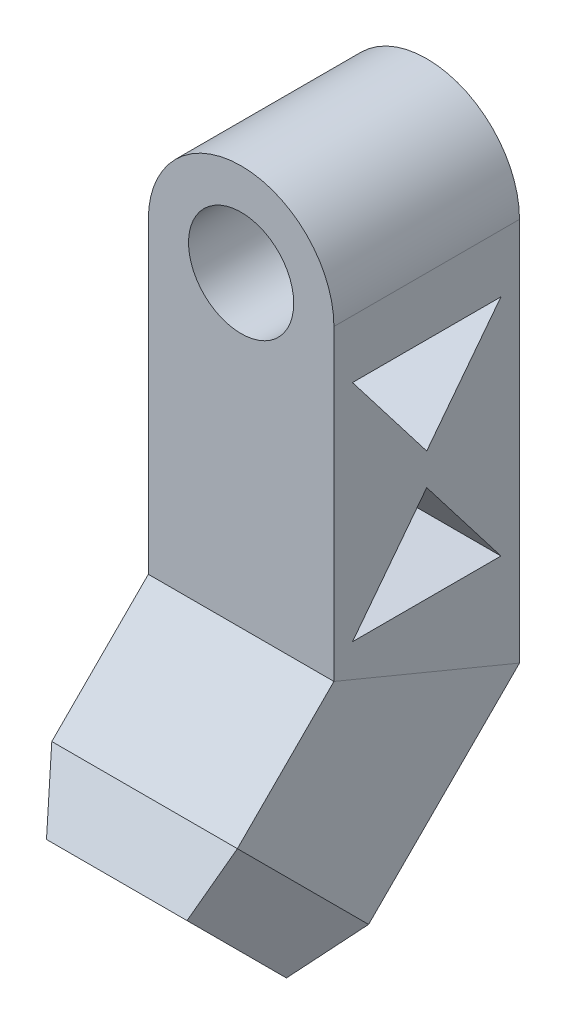
ISO-10303-21;
HEADER;
FILE_DESCRIPTION(('STEP AP214'),'2;1');
FILE_NAME('part.step','',(''),(''),'','','');
FILE_SCHEMA(('AUTOMOTIVE_DESIGN { 1 0 10303 214 1 1 1 1 }'));
ENDSEC;
DATA;
#1=APPLICATION_CONTEXT('core data for automotive mechanical design processes');
#2=APPLICATION_PROTOCOL_DEFINITION('international standard','automotive_design',2000,#1);
#3=PRODUCT_CONTEXT('',#1,'mechanical');
#4=PRODUCT('Part','Part','',(#3));
#5=PRODUCT_RELATED_PRODUCT_CATEGORY('part','',(#4));
#6=PRODUCT_DEFINITION_FORMATION('','',#4);
#7=PRODUCT_DEFINITION_CONTEXT('part definition',#1,'design');
#8=PRODUCT_DEFINITION('design','',#6,#7);
#9=PRODUCT_DEFINITION_SHAPE('','',#8);
#10=(LENGTH_UNIT() NAMED_UNIT(*) SI_UNIT(.MILLI.,.METRE.));
#11=(NAMED_UNIT(*) PLANE_ANGLE_UNIT() SI_UNIT($,.RADIAN.));
#12=(NAMED_UNIT(*) SI_UNIT($,.STERADIAN.) SOLID_ANGLE_UNIT());
#13=UNCERTAINTY_MEASURE_WITH_UNIT(LENGTH_MEASURE(1.E-05),#10,'distance_accuracy_value','');
#14=(GEOMETRIC_REPRESENTATION_CONTEXT(3) GLOBAL_UNCERTAINTY_ASSIGNED_CONTEXT((#13)) GLOBAL_UNIT_ASSIGNED_CONTEXT((#10,
#11,#12)) REPRESENTATION_CONTEXT('',''));
#15=CARTESIAN_POINT('',(0.,0.,0.));
#16=DIRECTION('',(0.,0.,1.));
#17=DIRECTION('',(1.,0.,0.));
#18=AXIS2_PLACEMENT_3D('',#15,#16,#17);
#19=CARTESIAN_POINT('',(19.05,45.0786722599583,7.26209610324912));
#20=DIRECTION('',(-1.,0.,0.));
#21=DIRECTION('',(0.,0.,1.));
#22=AXIS2_PLACEMENT_3D('',#19,#20,#21);
#23=PLANE('',#22);
#24=DIRECTION('',(0.,0.382683432365091,0.923879532511287));
#25=VECTOR('',#24,1.);
#26=CARTESIAN_POINT('',(19.05,42.5318762324136,41.3600079491902));
#27=LINE('',#26,#25);
#28=CARTESIAN_POINT('',(19.05,17.5092316367925,-19.05));
#29=VERTEX_POINT('',#28);
#30=CARTESIAN_POINT('',(19.05,33.2907683632075,19.05));
#31=VERTEX_POINT('',#30);
#32=EDGE_CURVE('E278',#29,#31,#27,.T.);
#33=ORIENTED_EDGE('',*,*,#32,.T.);
#34=DIRECTION('',(0.,-0.707106781186546,0.707106781186549));
#35=VECTOR('',#34,1.);
#36=CARTESIAN_POINT('',(19.05,45.0786722599583,7.26209610324912));
#37=LINE('',#36,#35);
#38=CARTESIAN_POINT('',(19.05,13.4703841816038,38.8703841816038));
#39=VERTEX_POINT('',#38);
#40=EDGE_CURVE('E49',#31,#39,#37,.T.);
#41=ORIENTED_EDGE('',*,*,#40,.T.);
#42=DIRECTION('',(0.,-0.707106781186549,-0.707106781186546));
#43=VECTOR('',#42,1.);
#44=CARTESIAN_POINT('',(19.05,13.4703841816038,38.8703841816038));
#45=LINE('',#44,#43);
#46=CARTESIAN_POINT('',(19.05,-13.4703841816038,11.9296158183964));
#47=VERTEX_POINT('',#46);
#48=EDGE_CURVE('E317',#39,#47,#45,.T.);
#49=ORIENTED_EDGE('',*,*,#48,.T.);
#50=DIRECTION('',(0.,-0.707106781186546,0.707106781186549));
#51=VECTOR('',#50,1.);
#52=CARTESIAN_POINT('',(19.05,18.1379038967508,-19.6786722599583));
#53=LINE('',#52,#51);
#54=EDGE_CURVE('E328',#29,#47,#53,.T.);
#55=ORIENTED_EDGE('',*,*,#54,.F.);
#56=EDGE_LOOP('',(#33,#41,#49,#55));
#57=FACE_BOUND('',#56,.T.);
#58=ADVANCED_FACE('F45',(#57),#23,.F.);
#59=CARTESIAN_POINT('',(-19.05,18.1379038967508,-19.6786722599583));
#60=DIRECTION('',(0.,0.707106781186549,0.707106781186546));
#61=DIRECTION('',(0.,-0.707106781186546,0.707106781186549));
#62=AXIS2_PLACEMENT_3D('',#59,#60,#61);
#63=PLANE('',#62);
#64=DIRECTION('',(1.,0.,0.));
#65=VECTOR('',#64,1.);
#66=CARTESIAN_POINT('',(-19.05,17.5092316367925,-19.05));
#67=LINE('',#66,#65);
#68=CARTESIAN_POINT('',(-19.05,17.5092316367925,-19.05));
#69=VERTEX_POINT('',#68);
#70=EDGE_CURVE('E11',#69,#29,#67,.T.);
#71=ORIENTED_EDGE('',*,*,#70,.T.);
#72=ORIENTED_EDGE('',*,*,#54,.T.);
#73=DIRECTION('',(-1.,0.,0.));
#74=VECTOR('',#73,1.);
#75=CARTESIAN_POINT('',(-19.05,-13.4703841816038,11.9296158183964));
#76=LINE('',#75,#74);
#77=CARTESIAN_POINT('',(-19.05,-13.4703841816038,11.9296158183964));
#78=VERTEX_POINT('',#77);
#79=EDGE_CURVE('E313',#47,#78,#76,.T.);
#80=ORIENTED_EDGE('',*,*,#79,.T.);
#81=DIRECTION('',(0.,-0.707106781186546,0.707106781186549));
#82=VECTOR('',#81,1.);
#83=CARTESIAN_POINT('',(-19.05,18.1379038967508,-19.6786722599583));
#84=LINE('',#83,#82);
#85=EDGE_CURVE('E325',#69,#78,#84,.T.);
#86=ORIENTED_EDGE('',*,*,#85,.F.);
#87=EDGE_LOOP('',(#71,#72,#80,#86));
#88=FACE_BOUND('',#87,.T.);
#89=ADVANCED_FACE('F352',(#88),#63,.F.);
#90=CARTESIAN_POINT('',(-19.05,45.0786722599583,7.26209610324912));
#91=DIRECTION('',(1.,0.,0.));
#92=DIRECTION('',(0.,0.,-1.));
#93=AXIS2_PLACEMENT_3D('',#90,#91,#92);
#94=PLANE('',#93);
#95=DIRECTION('',(0.,-0.382683432365091,-0.923879532511287));
#96=VECTOR('',#95,1.);
#97=CARTESIAN_POINT('',(-19.05,42.5318762324136,41.3600079491902));
#98=LINE('',#97,#96);
#99=CARTESIAN_POINT('',(-19.05,33.2907683632075,19.05));
#100=VERTEX_POINT('',#99);
#101=EDGE_CURVE('E55',#100,#69,#98,.T.);
#102=ORIENTED_EDGE('',*,*,#101,.T.);
#103=ORIENTED_EDGE('',*,*,#85,.T.);
#104=DIRECTION('',(0.,0.707106781186549,0.707106781186546));
#105=VECTOR('',#104,1.);
#106=CARTESIAN_POINT('',(-19.05,13.4703841816038,38.8703841816038));
#107=LINE('',#106,#105);
#108=CARTESIAN_POINT('',(-19.05,13.4703841816038,38.8703841816038));
#109=VERTEX_POINT('',#108);
#110=EDGE_CURVE('E309',#78,#109,#107,.T.);
#111=ORIENTED_EDGE('',*,*,#110,.T.);
#112=DIRECTION('',(0.,-0.707106781186546,0.707106781186549));
#113=VECTOR('',#112,1.);
#114=CARTESIAN_POINT('',(-19.05,45.0786722599583,7.26209610324912));
#115=LINE('',#114,#113);
#116=EDGE_CURVE('E321',#100,#109,#115,.T.);
#117=ORIENTED_EDGE('',*,*,#116,.F.);
#118=EDGE_LOOP('',(#102,#103,#111,#117));
#119=FACE_BOUND('',#118,.T.);
#120=ADVANCED_FACE('F350',(#119),#94,.F.);
#121=CARTESIAN_POINT('',(-19.05,45.0786722599583,7.26209610324912));
#122=DIRECTION('',(0.,-0.707106781186549,-0.707106781186546));
#123=DIRECTION('',(0.,0.707106781186546,-0.707106781186549));
#124=AXIS2_PLACEMENT_3D('',#121,#122,#123);
#125=PLANE('',#124);
#126=DIRECTION('',(-1.,0.,0.));
#127=VECTOR('',#126,1.);
#128=CARTESIAN_POINT('',(-19.05,33.2907683632075,19.05));
#129=LINE('',#128,#127);
#130=EDGE_CURVE('E274',#31,#100,#129,.T.);
#131=ORIENTED_EDGE('',*,*,#130,.T.);
#132=ORIENTED_EDGE('',*,*,#116,.T.);
#133=DIRECTION('',(1.,0.,0.));
#134=VECTOR('',#133,1.);
#135=CARTESIAN_POINT('',(-19.05,13.4703841816038,38.8703841816038));
#136=LINE('',#135,#134);
#137=EDGE_CURVE('E247',#109,#39,#136,.T.);
#138=ORIENTED_EDGE('',*,*,#137,.T.);
#139=ORIENTED_EDGE('',*,*,#40,.F.);
#140=EDGE_LOOP('',(#131,#132,#138,#139));
#141=FACE_BOUND('',#140,.T.);
#142=ADVANCED_FACE('F47',(#141),#125,.F.);
#143=CARTESIAN_POINT('',(-19.05,96.393,19.05));
#144=DIRECTION('',(0.,0.,-1.));
#145=DIRECTION('',(0.,1.,0.));
#146=AXIS2_PLACEMENT_3D('',#143,#144,#145);
#147=PLANE('',#146);
#148=CARTESIAN_POINT('',(0.,96.393,19.05));
#149=DIRECTION('',(0.,0.,1.));
#150=DIRECTION('',(1.,0.,0.));
#151=AXIS2_PLACEMENT_3D('',#148,#149,#150);
#152=CIRCLE('',#151,10.795);
#153=CARTESIAN_POINT('',(10.795,96.393,19.05));
#154=VERTEX_POINT('',#153);
#155=EDGE_CURVE('E224',#154,#154,#152,.T.);
#156=ORIENTED_EDGE('',*,*,#155,.F.);
#157=EDGE_LOOP('',(#156));
#158=FACE_BOUND('',#157,.T.);
#159=DIRECTION('',(0.,-1.,0.));
#160=VECTOR('',#159,1.);
#161=CARTESIAN_POINT('',(19.05,96.393,19.05));
#162=LINE('',#161,#160);
#163=CARTESIAN_POINT('',(19.05,96.393,19.05));
#164=VERTEX_POINT('',#163);
#165=EDGE_CURVE('E289',#164,#31,#162,.T.);
#166=ORIENTED_EDGE('',*,*,#165,.F.);
#167=CARTESIAN_POINT('',(0.,96.393,19.05));
#168=DIRECTION('',(0.,0.,-1.));
#169=DIRECTION('',(0.,1.,0.));
#170=AXIS2_PLACEMENT_3D('',#167,#168,#169);
#171=CIRCLE('',#170,19.05);
#172=CARTESIAN_POINT('',(-19.05,96.393,19.05));
#173=VERTEX_POINT('',#172);
#174=EDGE_CURVE('E236',#164,#173,#171,.F.);
#175=ORIENTED_EDGE('',*,*,#174,.T.);
#176=DIRECTION('',(0.,-1.,0.));
#177=VECTOR('',#176,1.);
#178=CARTESIAN_POINT('',(-19.05,96.393,19.05));
#179=LINE('',#178,#177);
#180=EDGE_CURVE('E296',#173,#100,#179,.T.);
#181=ORIENTED_EDGE('',*,*,#180,.T.);
#182=ORIENTED_EDGE('',*,*,#130,.F.);
#183=EDGE_LOOP('',(#166,#175,#181,#182));
#184=FACE_BOUND('',#183,.T.);
#185=ADVANCED_FACE('F383',(#158,#184),#147,.F.);
#186=CARTESIAN_POINT('',(-19.05,96.393,19.05));
#187=DIRECTION('',(1.,0.,0.));
#188=DIRECTION('',(0.,0.,-1.));
#189=AXIS2_PLACEMENT_3D('',#186,#187,#188);
#190=PLANE('',#189);
#191=DIRECTION('',(0.,-0.79225766010969,-0.610186692740443));
#192=VECTOR('',#191,1.);
#193=CARTESIAN_POINT('',(-19.05,38.4454298742545,-15.24));
#194=LINE('',#193,#192);
#195=CARTESIAN_POINT('',(-19.05,58.2328275407707,-2.22044604925031E-13));
#196=VERTEX_POINT('',#195);
#197=CARTESIAN_POINT('',(-19.05,38.4454298742545,-15.24));
#198=VERTEX_POINT('',#197);
#199=EDGE_CURVE('E174',#196,#198,#194,.T.);
#200=ORIENTED_EDGE('',*,*,#199,.F.);
#201=DIRECTION('',(0.,0.792257660109685,-0.610186692740449));
#202=VECTOR('',#201,1.);
#203=CARTESIAN_POINT('',(-19.05,58.2328275407707,-2.2940010280015E-13));
#204=LINE('',#203,#202);
#205=CARTESIAN_POINT('',(-19.05,38.4454298742543,15.24));
#206=VERTEX_POINT('',#205);
#207=EDGE_CURVE('E63',#206,#196,#204,.T.);
#208=ORIENTED_EDGE('',*,*,#207,.F.);
#209=DIRECTION('',(0.,0.,1.));
#210=VECTOR('',#209,1.);
#211=CARTESIAN_POINT('',(-19.05,38.4454298742545,-15.24));
#212=LINE('',#211,#210);
#213=EDGE_CURVE('E170',#198,#206,#212,.T.);
#214=ORIENTED_EDGE('',*,*,#213,.F.);
#215=EDGE_LOOP('',(#200,#208,#214));
#216=FACE_BOUND('',#215,.T.);
#217=DIRECTION('',(0.,0.792257660109685,0.610186692740449));
#218=VECTOR('',#217,1.);
#219=CARTESIAN_POINT('',(-19.05,64.7355055279154,-2.2940010280015E-13));
#220=LINE('',#219,#218);
#221=CARTESIAN_POINT('',(-19.05,64.7355055279154,-2.39391839684799E-13));
#222=VERTEX_POINT('',#221);
#223=CARTESIAN_POINT('',(-19.05,84.5229031944318,15.24));
#224=VERTEX_POINT('',#223);
#225=EDGE_CURVE('E203',#222,#224,#220,.T.);
#226=ORIENTED_EDGE('',*,*,#225,.F.);
#227=DIRECTION('',(0.,-0.79225766010969,0.610186692740443));
#228=VECTOR('',#227,1.);
#229=CARTESIAN_POINT('',(-19.05,84.5229031944316,-15.24));
#230=LINE('',#229,#228);
#231=CARTESIAN_POINT('',(-19.05,84.5229031944316,-15.24));
#232=VERTEX_POINT('',#231);
#233=EDGE_CURVE('E71',#232,#222,#230,.T.);
#234=ORIENTED_EDGE('',*,*,#233,.F.);
#235=DIRECTION('',(0.,0.,-1.));
#236=VECTOR('',#235,1.);
#237=CARTESIAN_POINT('',(-19.05,84.5229031944316,-15.24));
#238=LINE('',#237,#236);
#239=EDGE_CURVE('E199',#224,#232,#238,.T.);
#240=ORIENTED_EDGE('',*,*,#239,.F.);
#241=EDGE_LOOP('',(#226,#234,#240));
#242=FACE_BOUND('',#241,.T.);
#243=ORIENTED_EDGE('',*,*,#180,.F.);
#244=DIRECTION('',(0.,0.,1.));
#245=VECTOR('',#244,1.);
#246=CARTESIAN_POINT('',(-19.05,96.393,19.05));
#247=LINE('',#246,#245);
#248=CARTESIAN_POINT('',(-19.05,96.393,-19.05));
#249=VERTEX_POINT('',#248);
#250=EDGE_CURVE('E283',#249,#173,#247,.T.);
#251=ORIENTED_EDGE('',*,*,#250,.F.);
#252=DIRECTION('',(0.,-1.,0.));
#253=VECTOR('',#252,1.);
#254=CARTESIAN_POINT('',(-19.05,96.393,-19.05));
#255=LINE('',#254,#253);
#256=EDGE_CURVE('E288',#249,#69,#255,.T.);
#257=ORIENTED_EDGE('',*,*,#256,.T.);
#258=ORIENTED_EDGE('',*,*,#101,.F.);
#259=EDGE_LOOP('',(#243,#251,#257,#258));
#260=FACE_BOUND('',#259,.T.);
#261=ADVANCED_FACE('F378',(#216,#242,#260),#190,.F.);
#262=CARTESIAN_POINT('',(-19.05,96.393,-19.05));
#263=DIRECTION('',(0.,0.,1.));
#264=DIRECTION('',(0.,-1.,0.));
#265=AXIS2_PLACEMENT_3D('',#262,#263,#264);
#266=PLANE('',#265);
#267=CARTESIAN_POINT('',(0.,96.393,-19.05));
#268=DIRECTION('',(0.,0.,1.));
#269=DIRECTION('',(1.,0.,0.));
#270=AXIS2_PLACEMENT_3D('',#267,#268,#269);
#271=CIRCLE('',#270,10.795);
#272=CARTESIAN_POINT('',(10.795,96.393,-19.05));
#273=VERTEX_POINT('',#272);
#274=EDGE_CURVE('E228',#273,#273,#271,.T.);
#275=ORIENTED_EDGE('',*,*,#274,.T.);
#276=EDGE_LOOP('',(#275));
#277=FACE_BOUND('',#276,.T.);
#278=ORIENTED_EDGE('',*,*,#256,.F.);
#279=CARTESIAN_POINT('',(0.,96.393,-19.05));
#280=DIRECTION('',(0.,0.,-1.));
#281=DIRECTION('',(0.,1.,0.));
#282=AXIS2_PLACEMENT_3D('',#279,#280,#281);
#283=CIRCLE('',#282,19.05);
#284=CARTESIAN_POINT('',(19.05,96.393,-19.05));
#285=VERTEX_POINT('',#284);
#286=EDGE_CURVE('E232',#249,#285,#283,.T.);
#287=ORIENTED_EDGE('',*,*,#286,.T.);
#288=DIRECTION('',(0.,-1.,0.));
#289=VECTOR('',#288,1.);
#290=CARTESIAN_POINT('',(19.05,96.393,-19.05));
#291=LINE('',#290,#289);
#292=EDGE_CURVE('E284',#285,#29,#291,.T.);
#293=ORIENTED_EDGE('',*,*,#292,.T.);
#294=ORIENTED_EDGE('',*,*,#70,.F.);
#295=EDGE_LOOP('',(#278,#287,#293,#294));
#296=FACE_BOUND('',#295,.T.);
#297=ADVANCED_FACE('F372',(#277,#296),#266,.F.);
#298=CARTESIAN_POINT('',(19.05,96.393,19.05));
#299=DIRECTION('',(-1.,0.,0.));
#300=DIRECTION('',(0.,0.,1.));
#301=AXIS2_PLACEMENT_3D('',#298,#299,#300);
#302=PLANE('',#301);
#303=DIRECTION('',(0.,0.,1.));
#304=VECTOR('',#303,1.);
#305=CARTESIAN_POINT('',(19.05,38.4454298742545,-15.24));
#306=LINE('',#305,#304);
#307=CARTESIAN_POINT('',(19.05,38.4454298742545,-15.24));
#308=VERTEX_POINT('',#307);
#309=CARTESIAN_POINT('',(19.05,38.4454298742543,15.24));
#310=VERTEX_POINT('',#309);
#311=EDGE_CURVE('E158',#308,#310,#306,.T.);
#312=ORIENTED_EDGE('',*,*,#311,.T.);
#313=DIRECTION('',(0.,0.792257660109685,-0.610186692740449));
#314=VECTOR('',#313,1.);
#315=CARTESIAN_POINT('',(19.05,58.2328275407707,-2.2940010280015E-13));
#316=LINE('',#315,#314);
#317=CARTESIAN_POINT('',(19.05,58.2328275407707,-2.2940010280015E-13));
#318=VERTEX_POINT('',#317);
#319=EDGE_CURVE('E151',#310,#318,#316,.T.);
#320=ORIENTED_EDGE('',*,*,#319,.T.);
#321=DIRECTION('',(0.,-0.79225766010969,-0.610186692740443));
#322=VECTOR('',#321,1.);
#323=CARTESIAN_POINT('',(19.05,38.4454298742545,-15.24));
#324=LINE('',#323,#322);
#325=EDGE_CURVE('E162',#318,#308,#324,.T.);
#326=ORIENTED_EDGE('',*,*,#325,.T.);
#327=EDGE_LOOP('',(#312,#320,#326));
#328=FACE_BOUND('',#327,.T.);
#329=DIRECTION('',(0.,0.,-1.));
#330=VECTOR('',#329,1.);
#331=CARTESIAN_POINT('',(19.05,84.5229031944316,-15.24));
#332=LINE('',#331,#330);
#333=CARTESIAN_POINT('',(19.05,84.5229031944318,15.24));
#334=VERTEX_POINT('',#333);
#335=CARTESIAN_POINT('',(19.05,84.5229031944316,-15.24));
#336=VERTEX_POINT('',#335);
#337=EDGE_CURVE('E192',#334,#336,#332,.T.);
#338=ORIENTED_EDGE('',*,*,#337,.T.);
#339=DIRECTION('',(0.,-0.79225766010969,0.610186692740443));
#340=VECTOR('',#339,1.);
#341=CARTESIAN_POINT('',(19.05,84.5229031944316,-15.24));
#342=LINE('',#341,#340);
#343=CARTESIAN_POINT('',(19.05,64.7355055279154,-2.2940010280015E-13));
#344=VERTEX_POINT('',#343);
#345=EDGE_CURVE('E204',#336,#344,#342,.T.);
#346=ORIENTED_EDGE('',*,*,#345,.T.);
#347=DIRECTION('',(0.,0.792257660109685,0.610186692740449));
#348=VECTOR('',#347,1.);
#349=CARTESIAN_POINT('',(19.05,64.7355055279154,-2.2940010280015E-13));
#350=LINE('',#349,#348);
#351=EDGE_CURVE('E213',#344,#334,#350,.T.);
#352=ORIENTED_EDGE('',*,*,#351,.T.);
#353=EDGE_LOOP('',(#338,#346,#352));
#354=FACE_BOUND('',#353,.T.);
#355=ORIENTED_EDGE('',*,*,#292,.F.);
#356=DIRECTION('',(0.,0.,-1.));
#357=VECTOR('',#356,1.);
#358=CARTESIAN_POINT('',(19.05,96.393,19.05));
#359=LINE('',#358,#357);
#360=EDGE_CURVE('E279',#164,#285,#359,.T.);
#361=ORIENTED_EDGE('',*,*,#360,.F.);
#362=ORIENTED_EDGE('',*,*,#165,.T.);
#363=ORIENTED_EDGE('',*,*,#32,.F.);
#364=EDGE_LOOP('',(#355,#361,#362,#363));
#365=FACE_BOUND('',#364,.T.);
#366=ADVANCED_FACE('F167',(#328,#354,#365),#302,.F.);
#367=CARTESIAN_POINT('',(-19.05,-13.4703841816038,11.9296158183964));
#368=DIRECTION('',(0.,-0.906307787036651,-0.422618261740697));
#369=DIRECTION('',(0.,0.422618261740697,-0.906307787036651));
#370=AXIS2_PLACEMENT_3D('',#367,#368,#369);
#371=PLANE('',#370);
#372=ORIENTED_EDGE('',*,*,#79,.F.);
#373=DIRECTION('',(0.323615577118185,0.399876601840004,-0.857538139995741));
#374=VECTOR('',#373,1.);
#375=CARTESIAN_POINT('',(19.05,-13.4703841816038,11.9296158183964));
#376=LINE('',#375,#374);
#377=CARTESIAN_POINT('',(14.4275780248192,-19.1820943785168,24.1784178636216));
#378=VERTEX_POINT('',#377);
#379=EDGE_CURVE('E244',#378,#47,#376,.T.);
#380=ORIENTED_EDGE('',*,*,#379,.F.);
#381=DIRECTION('',(-1.,0.,0.));
#382=VECTOR('',#381,1.);
#383=CARTESIAN_POINT('',(-19.05,-19.1820943785168,24.1784178636216));
#384=LINE('',#383,#382);
#385=CARTESIAN_POINT('',(-14.4275780248192,-19.1820943785168,24.1784178636216));
#386=VERTEX_POINT('',#385);
#387=EDGE_CURVE('E240',#386,#378,#384,.F.);
#388=ORIENTED_EDGE('',*,*,#387,.F.);
#389=DIRECTION('',(-0.323615577118185,0.399876601840004,-0.857538139995741));
#390=VECTOR('',#389,1.);
#391=CARTESIAN_POINT('',(-19.05,-13.4703841816038,11.9296158183964));
#392=LINE('',#391,#390);
#393=EDGE_CURVE('E249',#386,#78,#392,.T.);
#394=ORIENTED_EDGE('',*,*,#393,.T.);
#395=EDGE_LOOP('',(#372,#380,#388,#394));
#396=FACE_BOUND('',#395,.T.);
#397=ADVANCED_FACE('F356',(#396),#371,.T.);
#398=CARTESIAN_POINT('',(19.05,-13.4703841816038,11.9296158183964));
#399=DIRECTION('',(0.939692620785908,-0.241844762647975,0.241844762647976));
#400=DIRECTION('',(0.249243569363955,0.,-0.968440830991091));
#401=AXIS2_PLACEMENT_3D('',#398,#399,#400);
#402=PLANE('',#401);
#403=ORIENTED_EDGE('',*,*,#48,.F.);
#404=DIRECTION('',(0.323615577118185,0.857538139995739,-0.399876601840008));
#405=VECTOR('',#404,1.);
#406=CARTESIAN_POINT('',(19.05,13.4703841816038,38.8703841816038));
#407=LINE('',#406,#405);
#408=CARTESIAN_POINT('',(14.4275780248192,1.22158213637858,44.5820943785169));
#409=VERTEX_POINT('',#408);
#410=EDGE_CURVE('E248',#409,#39,#407,.T.);
#411=ORIENTED_EDGE('',*,*,#410,.F.);
#412=DIRECTION('',(0.,-0.707106781186549,-0.707106781186546));
#413=VECTOR('',#412,1.);
#414=CARTESIAN_POINT('',(14.4275780248192,-22.4506403026729,20.9098719394655));
#415=LINE('',#414,#413);
#416=EDGE_CURVE('E263',#378,#409,#415,.F.);
#417=ORIENTED_EDGE('',*,*,#416,.F.);
#418=ORIENTED_EDGE('',*,*,#379,.T.);
#419=EDGE_LOOP('',(#403,#411,#417,#418));
#420=FACE_BOUND('',#419,.T.);
#421=ADVANCED_FACE('F361',(#420),#402,.T.);
#422=CARTESIAN_POINT('',(19.05,13.4703841816038,38.8703841816038));
#423=DIRECTION('',(0.,0.4226182617407,0.906307787036649));
#424=DIRECTION('',(0.,-0.90630778703665,0.4226182617407));
#425=AXIS2_PLACEMENT_3D('',#422,#423,#424);
#426=PLANE('',#425);
#427=ORIENTED_EDGE('',*,*,#137,.F.);
#428=DIRECTION('',(-0.323615577118185,0.857538139995739,-0.399876601840008));
#429=VECTOR('',#428,1.);
#430=CARTESIAN_POINT('',(-19.05,13.4703841816038,38.8703841816038));
#431=LINE('',#430,#429);
#432=CARTESIAN_POINT('',(-14.4275780248192,1.22158213637858,44.5820943785169));
#433=VERTEX_POINT('',#432);
#434=EDGE_CURVE('E253',#433,#109,#431,.T.);
#435=ORIENTED_EDGE('',*,*,#434,.F.);
#436=DIRECTION('',(1.,0.,0.));
#437=VECTOR('',#436,1.);
#438=CARTESIAN_POINT('',(19.05,1.22158213637857,44.5820943785169));
#439=LINE('',#438,#437);
#440=EDGE_CURVE('E266',#409,#433,#439,.F.);
#441=ORIENTED_EDGE('',*,*,#440,.F.);
#442=ORIENTED_EDGE('',*,*,#410,.T.);
#443=EDGE_LOOP('',(#427,#435,#441,#442));
#444=FACE_BOUND('',#443,.T.);
#445=ADVANCED_FACE('F342',(#444),#426,.T.);
#446=CARTESIAN_POINT('',(-19.05,13.4703841816038,38.8703841816038));
#447=DIRECTION('',(-0.939692620785908,-0.241844762647975,0.241844762647976));
#448=DIRECTION('',(0.249243569363955,0.,0.968440830991091));
#449=AXIS2_PLACEMENT_3D('',#446,#447,#448);
#450=PLANE('',#449);
#451=ORIENTED_EDGE('',*,*,#110,.F.);
#452=ORIENTED_EDGE('',*,*,#393,.F.);
#453=DIRECTION('',(0.,0.707106781186549,0.707106781186546));
#454=VECTOR('',#453,1.);
#455=CARTESIAN_POINT('',(-14.4275780248192,4.49012806053463,47.850640302673));
#456=LINE('',#455,#454);
#457=EDGE_CURVE('E254',#433,#386,#456,.F.);
#458=ORIENTED_EDGE('',*,*,#457,.F.);
#459=ORIENTED_EDGE('',*,*,#434,.T.);
#460=EDGE_LOOP('',(#451,#452,#458,#459));
#461=FACE_BOUND('',#460,.T.);
#462=ADVANCED_FACE('F347',(#461),#450,.T.);
#463=CARTESIAN_POINT('',(0.,-21.6802561210692,21.6802561210693));
#464=DIRECTION('',(0.,-0.707106781186546,0.707106781186549));
#465=DIRECTION('',(0.,-0.707106781186549,-0.707106781186546));
#466=AXIS2_PLACEMENT_3D('',#463,#464,#465);
#467=PLANE('',#466);
#468=CARTESIAN_POINT('',(0.,-8.98025612106913,34.3802561210692));
#469=DIRECTION('',(0.,-0.707106781186546,0.707106781186549));
#470=DIRECTION('',(0.,-0.707106781186549,-0.707106781186546));
#471=AXIS2_PLACEMENT_3D('',#468,#469,#470);
#472=CIRCLE('',#471,10.795);
#473=CARTESIAN_POINT('',(0.,-16.6134738239779,26.7470384181605));
#474=VERTEX_POINT('',#473);
#475=EDGE_CURVE('E186',#474,#474,#472,.T.);
#476=ORIENTED_EDGE('',*,*,#475,.F.);
#477=EDGE_LOOP('',(#476));
#478=FACE_BOUND('',#477,.T.);
#479=ORIENTED_EDGE('',*,*,#387,.T.);
#480=ORIENTED_EDGE('',*,*,#416,.T.);
#481=ORIENTED_EDGE('',*,*,#440,.T.);
#482=ORIENTED_EDGE('',*,*,#457,.T.);
#483=EDGE_LOOP('',(#479,#480,#481,#482));
#484=FACE_BOUND('',#483,.T.);
#485=ADVANCED_FACE('F359',(#478,#484),#467,.T.);
#486=CARTESIAN_POINT('',(0.,96.393,61.647094971371));
#487=DIRECTION('',(0.,0.,-1.));
#488=DIRECTION('',(0.,1.,0.));
#489=AXIS2_PLACEMENT_3D('',#486,#487,#488);
#490=CYLINDRICAL_SURFACE('',#489,19.05);
#491=ORIENTED_EDGE('',*,*,#174,.F.);
#492=ORIENTED_EDGE('',*,*,#360,.T.);
#493=ORIENTED_EDGE('',*,*,#286,.F.);
#494=ORIENTED_EDGE('',*,*,#250,.T.);
#495=EDGE_LOOP('',(#491,#492,#493,#494));
#496=FACE_BOUND('',#495,.T.);
#497=ADVANCED_FACE('F436',(#496),#490,.T.);
#498=CARTESIAN_POINT('',(0.,96.393,-19.05));
#499=DIRECTION('',(0.,0.,1.));
#500=DIRECTION('',(1.,0.,0.));
#501=AXIS2_PLACEMENT_3D('',#498,#499,#500);
#502=CYLINDRICAL_SURFACE('',#501,10.795);
#503=CARTESIAN_POINT('',(10.795,96.393,-19.05));
#504=CARTESIAN_POINT('',(10.795,96.393,-18.653125));
#505=CARTESIAN_POINT('',(10.795,96.393,-18.25625));
#506=CARTESIAN_POINT('',(10.795,96.393,-17.4625));
#507=CARTESIAN_POINT('',(10.795,96.393,-17.065625));
#508=CARTESIAN_POINT('',(10.795,96.393,-16.271875));
#509=CARTESIAN_POINT('',(10.795,96.393,-15.875));
#510=CARTESIAN_POINT('',(10.795,96.393,-15.08125));
#511=CARTESIAN_POINT('',(10.795,96.393,-14.684375));
#512=CARTESIAN_POINT('',(10.795,96.393,-13.890625));
#513=CARTESIAN_POINT('',(10.795,96.393,-13.49375));
#514=CARTESIAN_POINT('',(10.795,96.393,-12.7));
#515=CARTESIAN_POINT('',(10.795,96.393,-12.303125));
#516=CARTESIAN_POINT('',(10.795,96.393,-11.509375));
#517=CARTESIAN_POINT('',(10.795,96.393,-11.1125));
#518=CARTESIAN_POINT('',(10.795,96.393,-10.31875));
#519=CARTESIAN_POINT('',(10.795,96.393,-9.92187500000001));
#520=CARTESIAN_POINT('',(10.795,96.393,-9.12812500000001));
#521=CARTESIAN_POINT('',(10.795,96.393,-8.73125000000001));
#522=CARTESIAN_POINT('',(10.795,96.393,-7.93750000000001));
#523=CARTESIAN_POINT('',(10.795,96.393,-7.54062500000001));
#524=CARTESIAN_POINT('',(10.795,96.393,-6.74687500000001));
#525=CARTESIAN_POINT('',(10.795,96.393,-6.35000000000001));
#526=CARTESIAN_POINT('',(10.795,96.393,-5.55625000000001));
#527=CARTESIAN_POINT('',(10.795,96.393,-5.15937500000001));
#528=CARTESIAN_POINT('',(10.795,96.393,-4.36562500000001));
#529=CARTESIAN_POINT('',(10.795,96.393,-3.96875000000001));
#530=CARTESIAN_POINT('',(10.795,96.393,-3.17500000000001));
#531=CARTESIAN_POINT('',(10.795,96.393,-2.77812500000001));
#532=CARTESIAN_POINT('',(10.795,96.393,-1.98437500000001));
#533=CARTESIAN_POINT('',(10.795,96.393,-1.58750000000001));
#534=CARTESIAN_POINT('',(10.795,96.393,-0.793750000000011));
#535=CARTESIAN_POINT('',(10.795,96.393,-0.396875000000011));
#536=CARTESIAN_POINT('',(10.795,96.393,0.39687499999999));
#537=CARTESIAN_POINT('',(10.795,96.393,0.79374999999999));
#538=CARTESIAN_POINT('',(10.795,96.393,1.58749999999999));
#539=CARTESIAN_POINT('',(10.795,96.393,1.98437499999999));
#540=CARTESIAN_POINT('',(10.795,96.393,2.77812499999999));
#541=CARTESIAN_POINT('',(10.795,96.393,3.17499999999999));
#542=CARTESIAN_POINT('',(10.795,96.393,3.96874999999999));
#543=CARTESIAN_POINT('',(10.795,96.393,4.36562499999999));
#544=CARTESIAN_POINT('',(10.795,96.393,5.15937499999999));
#545=CARTESIAN_POINT('',(10.795,96.393,5.55624999999999));
#546=CARTESIAN_POINT('',(10.795,96.393,6.34999999999999));
#547=CARTESIAN_POINT('',(10.795,96.393,6.74687499999999));
#548=CARTESIAN_POINT('',(10.795,96.393,7.54062499999999));
#549=CARTESIAN_POINT('',(10.795,96.393,7.93749999999999));
#550=CARTESIAN_POINT('',(10.795,96.393,8.73124999999999));
#551=CARTESIAN_POINT('',(10.795,96.393,9.12812499999999));
#552=CARTESIAN_POINT('',(10.795,96.393,9.92187499999999));
#553=CARTESIAN_POINT('',(10.795,96.393,10.31875));
#554=CARTESIAN_POINT('',(10.795,96.393,11.1125));
#555=CARTESIAN_POINT('',(10.795,96.393,11.509375));
#556=CARTESIAN_POINT('',(10.795,96.393,12.303125));
#557=CARTESIAN_POINT('',(10.795,96.393,12.7));
#558=CARTESIAN_POINT('',(10.795,96.393,13.49375));
#559=CARTESIAN_POINT('',(10.795,96.393,13.890625));
#560=CARTESIAN_POINT('',(10.795,96.393,14.684375));
#561=CARTESIAN_POINT('',(10.795,96.393,15.08125));
#562=CARTESIAN_POINT('',(10.795,96.393,15.875));
#563=CARTESIAN_POINT('',(10.795,96.393,16.271875));
#564=CARTESIAN_POINT('',(10.795,96.393,17.065625));
#565=CARTESIAN_POINT('',(10.795,96.393,17.4625));
#566=CARTESIAN_POINT('',(10.795,96.393,18.25625));
#567=CARTESIAN_POINT('',(10.795,96.393,18.653125));
#568=CARTESIAN_POINT('',(10.795,96.393,19.05));
#569=B_SPLINE_CURVE_WITH_KNOTS('',3,(#503,#504,#505,#506,#507,#508,#509,#510,#511,#512,#513,
#514,#515,#516,#517,#518,#519,#520,#521,#522,#523,#524,#525,#526,#527,#528,#529,#530,#531,#532,
#533,#534,#535,#536,#537,#538,#539,#540,#541,#542,#543,#544,#545,#546,#547,#548,#549,#550,#551,
#552,#553,#554,#555,#556,#557,#558,#559,#560,#561,#562,#563,#564,#565,#566,#567,#568),
.UNSPECIFIED.,.F.,.F.,(4,2,2,2,2,2,2,2,2,2,2,2,2,2,2,2,2,2,2,2,2,2,2,2,2,2,2,2,2,2,2,2,4),(0.,
1.190625,2.38125,3.571875,4.7625,5.953125,7.14375,8.334375,9.525,10.715625,11.90625,13.096875,
14.2875,15.478125,16.66875,17.859375,19.05,20.240625,21.43125,22.621875,23.8125,25.003125,
26.19375,27.384375,28.575,29.765625,30.95625,32.146875,33.3375,34.528125,35.71875,36.909375,
38.1),.UNSPECIFIED.);
#570=EDGE_CURVE('BSEAM462',#273,#154,#569,.T.);
#571=ORIENTED_EDGE('',*,*,#274,.F.);
#572=ORIENTED_EDGE('',*,*,#155,.T.);
#573=ORIENTED_EDGE('',*,*,#570,.T.);
#574=ORIENTED_EDGE('',*,*,#570,.F.);
#575=EDGE_LOOP('',(#571,#573,#572,#574));
#576=FACE_BOUND('',#575,.T.);
#577=ADVANCED_FACE('F462',(#576),#502,.F.);
#578=CARTESIAN_POINT('',(0.,0.,25.4000000000001));
#579=DIRECTION('',(0.,-0.707106781186546,0.707106781186549));
#580=DIRECTION('',(0.,-0.707106781186549,-0.707106781186546));
#581=AXIS2_PLACEMENT_3D('',#578,#579,#580);
#582=CYLINDRICAL_SURFACE('',#581,10.795);
#583=CARTESIAN_POINT('',(0.,0.,25.4000000000001));
#584=DIRECTION('',(0.,-0.707106781186546,0.707106781186549));
#585=DIRECTION('',(0.,-0.707106781186549,-0.707106781186546));
#586=AXIS2_PLACEMENT_3D('',#583,#584,#585);
#587=CIRCLE('',#586,10.795);
#588=CARTESIAN_POINT('',(0.,-7.63321770290879,17.7667822970913));
#589=VERTEX_POINT('',#588);
#590=EDGE_CURVE('E220',#589,#589,#587,.T.);
#591=ORIENTED_EDGE('',*,*,#590,.F.);
#592=EDGE_LOOP('',(#591));
#593=FACE_BOUND('',#592,.T.);
#594=ORIENTED_EDGE('',*,*,#475,.T.);
#595=EDGE_LOOP('',(#594));
#596=FACE_BOUND('',#595,.T.);
#597=ADVANCED_FACE('F471',(#593,#596),#582,.F.);
#598=CARTESIAN_POINT('',(0.,0.,25.4000000000001));
#599=DIRECTION('',(0.,-0.707106781186546,0.707106781186549));
#600=DIRECTION('',(0.,-0.707106781186549,-0.707106781186546));
#601=AXIS2_PLACEMENT_3D('',#598,#599,#600);
#602=PLANE('',#601);
#603=ORIENTED_EDGE('',*,*,#590,.T.);
#604=EDGE_LOOP('',(#603));
#605=FACE_BOUND('',#604,.T.);
#606=ADVANCED_FACE('F480',(#605),#602,.T.);
#607=CARTESIAN_POINT('',(19.05,84.5229031944316,-15.24));
#608=DIRECTION('',(0.,-0.610186692740443,-0.79225766010969));
#609=DIRECTION('',(0.,0.79225766010969,-0.610186692740443));
#610=AXIS2_PLACEMENT_3D('',#607,#608,#609);
#611=PLANE('',#610);
#612=ORIENTED_EDGE('',*,*,#233,.T.);
#613=DIRECTION('',(-1.,0.,0.));
#614=VECTOR('',#613,1.);
#615=CARTESIAN_POINT('',(19.05,64.7355055279154,-2.2940010280015E-13));
#616=LINE('',#615,#614);
#617=EDGE_CURVE('E189',#344,#222,#616,.T.);
#618=ORIENTED_EDGE('',*,*,#617,.F.);
#619=ORIENTED_EDGE('',*,*,#345,.F.);
#620=DIRECTION('',(-1.,0.,0.));
#621=VECTOR('',#620,1.);
#622=CARTESIAN_POINT('',(19.05,84.5229031944316,-15.24));
#623=LINE('',#622,#621);
#624=EDGE_CURVE('E196',#336,#232,#623,.T.);
#625=ORIENTED_EDGE('',*,*,#624,.T.);
#626=EDGE_LOOP('',(#612,#618,#619,#625));
#627=FACE_BOUND('',#626,.T.);
#628=ADVANCED_FACE('F490',(#627),#611,.F.);
#629=CARTESIAN_POINT('',(19.05,84.5229031944316,-15.24));
#630=DIRECTION('',(0.,1.,0.));
#631=DIRECTION('',(0.,0.,1.));
#632=AXIS2_PLACEMENT_3D('',#629,#630,#631);
#633=PLANE('',#632);
#634=ORIENTED_EDGE('',*,*,#239,.T.);
#635=ORIENTED_EDGE('',*,*,#624,.F.);
#636=ORIENTED_EDGE('',*,*,#337,.F.);
#637=DIRECTION('',(-1.,0.,0.));
#638=VECTOR('',#637,1.);
#639=CARTESIAN_POINT('',(19.05,84.5229031944318,15.24));
#640=LINE('',#639,#638);
#641=EDGE_CURVE('E193',#334,#224,#640,.T.);
#642=ORIENTED_EDGE('',*,*,#641,.T.);
#643=EDGE_LOOP('',(#634,#635,#636,#642));
#644=FACE_BOUND('',#643,.T.);
#645=ADVANCED_FACE('F499',(#644),#633,.F.);
#646=CARTESIAN_POINT('',(19.05,64.7355055279154,-2.2940010280015E-13));
#647=DIRECTION('',(0.,-0.610186692740449,0.792257660109685));
#648=DIRECTION('',(0.,-0.792257660109685,-0.610186692740449));
#649=AXIS2_PLACEMENT_3D('',#646,#647,#648);
#650=PLANE('',#649);
#651=ORIENTED_EDGE('',*,*,#225,.T.);
#652=ORIENTED_EDGE('',*,*,#641,.F.);
#653=ORIENTED_EDGE('',*,*,#351,.F.);
#654=ORIENTED_EDGE('',*,*,#617,.T.);
#655=EDGE_LOOP('',(#651,#652,#653,#654));
#656=FACE_BOUND('',#655,.T.);
#657=ADVANCED_FACE('F508',(#656),#650,.F.);
#658=CARTESIAN_POINT('',(19.05,58.2328275407707,-2.2940010280015E-13));
#659=DIRECTION('',(0.,0.610186692740449,0.792257660109685));
#660=DIRECTION('',(0.,-0.792257660109685,0.610186692740449));
#661=AXIS2_PLACEMENT_3D('',#658,#659,#660);
#662=PLANE('',#661);
#663=ORIENTED_EDGE('',*,*,#207,.T.);
#664=DIRECTION('',(-1.,0.,0.));
#665=VECTOR('',#664,1.);
#666=CARTESIAN_POINT('',(19.05,58.2328275407707,-2.2940010280015E-13));
#667=LINE('',#666,#665);
#668=EDGE_CURVE('E147',#318,#196,#667,.T.);
#669=ORIENTED_EDGE('',*,*,#668,.F.);
#670=ORIENTED_EDGE('',*,*,#319,.F.);
#671=DIRECTION('',(-1.,0.,0.));
#672=VECTOR('',#671,1.);
#673=CARTESIAN_POINT('',(19.05,38.4454298742543,15.24));
#674=LINE('',#673,#672);
#675=EDGE_CURVE('E183',#310,#206,#674,.T.);
#676=ORIENTED_EDGE('',*,*,#675,.T.);
#677=EDGE_LOOP('',(#663,#669,#670,#676));
#678=FACE_BOUND('',#677,.T.);
#679=ADVANCED_FACE('F149',(#678),#662,.F.);
#680=CARTESIAN_POINT('',(19.05,38.4454298742545,-15.24));
#681=DIRECTION('',(0.,-1.,0.));
#682=DIRECTION('',(0.,0.,-1.));
#683=AXIS2_PLACEMENT_3D('',#680,#681,#682);
#684=PLANE('',#683);
#685=ORIENTED_EDGE('',*,*,#213,.T.);
#686=ORIENTED_EDGE('',*,*,#675,.F.);
#687=ORIENTED_EDGE('',*,*,#311,.F.);
#688=DIRECTION('',(-1.,0.,0.));
#689=VECTOR('',#688,1.);
#690=CARTESIAN_POINT('',(19.05,38.4454298742545,-15.24));
#691=LINE('',#690,#689);
#692=EDGE_CURVE('E157',#308,#198,#691,.T.);
#693=ORIENTED_EDGE('',*,*,#692,.T.);
#694=EDGE_LOOP('',(#685,#686,#687,#693));
#695=FACE_BOUND('',#694,.T.);
#696=ADVANCED_FACE('F527',(#695),#684,.F.);
#697=CARTESIAN_POINT('',(19.05,38.4454298742545,-15.24));
#698=DIRECTION('',(0.,0.610186692740442,-0.79225766010969));
#699=DIRECTION('',(0.,0.79225766010969,0.610186692740443));
#700=AXIS2_PLACEMENT_3D('',#697,#698,#699);
#701=PLANE('',#700);
#702=ORIENTED_EDGE('',*,*,#199,.T.);
#703=ORIENTED_EDGE('',*,*,#692,.F.);
#704=ORIENTED_EDGE('',*,*,#325,.F.);
#705=ORIENTED_EDGE('',*,*,#668,.T.);
#706=EDGE_LOOP('',(#702,#703,#704,#705));
#707=FACE_BOUND('',#706,.T.);
#708=ADVANCED_FACE('F163',(#707),#701,.F.);
#709=CLOSED_SHELL('',(#58,#89,#120,#142,#185,#261,#297,#366,#397,#421,#445,#462,#485,#497,#577,
#597,#606,#628,#645,#657,#679,#696,#708));
#710=MANIFOLD_SOLID_BREP('B2',#709);
#711=ADVANCED_BREP_SHAPE_REPRESENTATION('',(#18,#710),#14);
#712=SHAPE_DEFINITION_REPRESENTATION(#9,#711);
ENDSEC;
END-ISO-10303-21;
